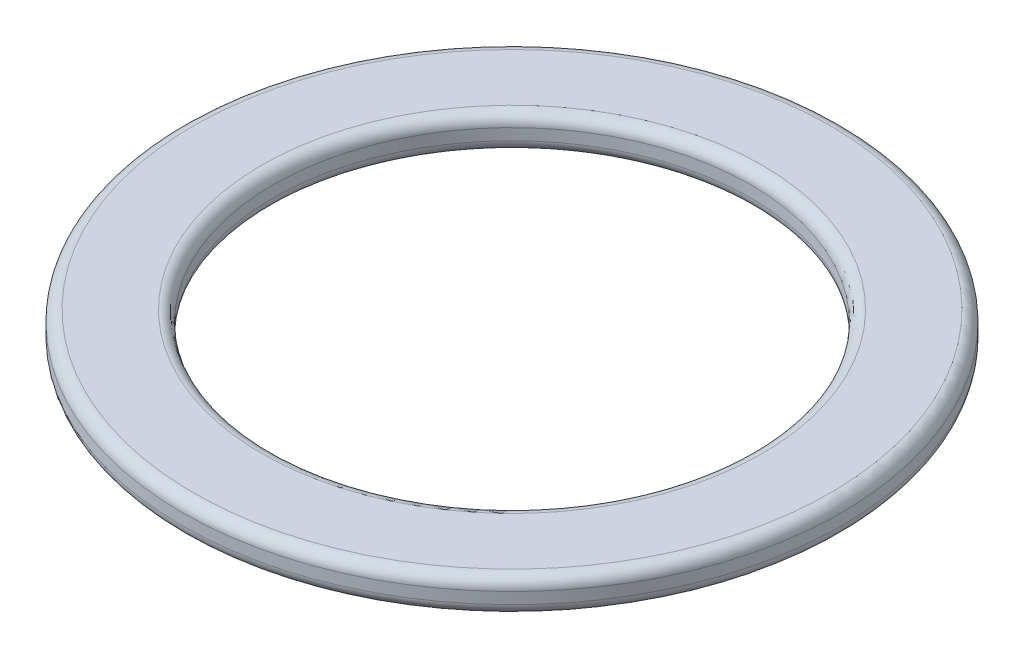
ISO-10303-21;
HEADER;
FILE_DESCRIPTION(('STEP AP214'),'2;1');
FILE_NAME('part.step','',(''),(''),'','','');
FILE_SCHEMA(('AUTOMOTIVE_DESIGN { 1 0 10303 214 1 1 1 1 }'));
ENDSEC;
DATA;
#1=APPLICATION_CONTEXT('core data for automotive mechanical design processes');
#2=APPLICATION_PROTOCOL_DEFINITION('international standard','automotive_design',2000,#1);
#3=PRODUCT_CONTEXT('',#1,'mechanical');
#4=PRODUCT('Part','Part','',(#3));
#5=PRODUCT_RELATED_PRODUCT_CATEGORY('part','',(#4));
#6=PRODUCT_DEFINITION_FORMATION('','',#4);
#7=PRODUCT_DEFINITION_CONTEXT('part definition',#1,'design');
#8=PRODUCT_DEFINITION('design','',#6,#7);
#9=PRODUCT_DEFINITION_SHAPE('','',#8);
#10=(LENGTH_UNIT() NAMED_UNIT(*) SI_UNIT(.MILLI.,.METRE.));
#11=(NAMED_UNIT(*) PLANE_ANGLE_UNIT() SI_UNIT($,.RADIAN.));
#12=(NAMED_UNIT(*) SI_UNIT($,.STERADIAN.) SOLID_ANGLE_UNIT());
#13=UNCERTAINTY_MEASURE_WITH_UNIT(LENGTH_MEASURE(1.E-05),#10,'distance_accuracy_value','');
#14=(GEOMETRIC_REPRESENTATION_CONTEXT(3) GLOBAL_UNCERTAINTY_ASSIGNED_CONTEXT((#13)) GLOBAL_UNIT_ASSIGNED_CONTEXT((#10,
#11,#12)) REPRESENTATION_CONTEXT('',''));
#15=CARTESIAN_POINT('',(0.,0.,0.));
#16=DIRECTION('',(0.,0.,1.));
#17=DIRECTION('',(1.,0.,0.));
#18=AXIS2_PLACEMENT_3D('',#15,#16,#17);
#19=CARTESIAN_POINT('',(0.,0.,0.));
#20=DIRECTION('',(0.,-1.,0.));
#21=DIRECTION('',(0.,0.,-1.));
#22=AXIS2_PLACEMENT_3D('',#19,#20,#21);
#23=CYLINDRICAL_SURFACE('',#22,21.);
#24=CARTESIAN_POINT('',(0.,1.,0.));
#25=DIRECTION('',(0.,1.,0.));
#26=DIRECTION('',(0.,0.,1.));
#27=AXIS2_PLACEMENT_3D('',#24,#25,#26);
#28=CIRCLE('',#27,21.);
#29=CARTESIAN_POINT('',(0.,1.,21.));
#30=VERTEX_POINT('',#29);
#31=EDGE_CURVE('E55',#30,#30,#28,.F.);
#32=ORIENTED_EDGE('',*,*,#31,.T.);
#33=EDGE_LOOP('',(#32));
#34=FACE_BOUND('',#33,.T.);
#35=CARTESIAN_POINT('',(0.,2.,0.));
#36=DIRECTION('',(0.,-1.,0.));
#37=DIRECTION('',(0.,0.,-1.));
#38=AXIS2_PLACEMENT_3D('',#35,#36,#37);
#39=CIRCLE('',#38,21.);
#40=CARTESIAN_POINT('',(0.,2.,-21.));
#41=VERTEX_POINT('',#40);
#42=EDGE_CURVE('E58',#41,#41,#39,.F.);
#43=ORIENTED_EDGE('',*,*,#42,.T.);
#44=EDGE_LOOP('',(#43));
#45=FACE_BOUND('',#44,.T.);
#46=ADVANCED_FACE('F30',(#34,#45),#23,.F.);
#47=CARTESIAN_POINT('',(-21.,0.,0.));
#48=DIRECTION('',(0.,1.,0.));
#49=DIRECTION('',(0.,0.,1.));
#50=AXIS2_PLACEMENT_3D('',#47,#48,#49);
#51=PLANE('',#50);
#52=CARTESIAN_POINT('',(0.,0.,0.));
#53=DIRECTION('',(0.,1.,0.));
#54=DIRECTION('',(0.,0.,1.));
#55=AXIS2_PLACEMENT_3D('',#52,#53,#54);
#56=CIRCLE('',#55,22.);
#57=CARTESIAN_POINT('',(0.,0.,22.));
#58=VERTEX_POINT('',#57);
#59=EDGE_CURVE('E49',#58,#58,#56,.T.);
#60=ORIENTED_EDGE('',*,*,#59,.T.);
#61=EDGE_LOOP('',(#60));
#62=FACE_BOUND('',#61,.T.);
#63=CARTESIAN_POINT('',(0.,0.,0.));
#64=DIRECTION('',(0.,1.,0.));
#65=DIRECTION('',(0.,0.,1.));
#66=AXIS2_PLACEMENT_3D('',#63,#64,#65);
#67=CIRCLE('',#66,28.);
#68=CARTESIAN_POINT('',(0.,0.,28.));
#69=VERTEX_POINT('',#68);
#70=EDGE_CURVE('E52',#69,#69,#67,.F.);
#71=ORIENTED_EDGE('',*,*,#70,.T.);
#72=EDGE_LOOP('',(#71));
#73=FACE_BOUND('',#72,.T.);
#74=ADVANCED_FACE('F88',(#62,#73),#51,.F.);
#75=CARTESIAN_POINT('',(0.,0.,0.));
#76=DIRECTION('',(0.,-1.,0.));
#77=DIRECTION('',(0.,0.,-1.));
#78=AXIS2_PLACEMENT_3D('',#75,#76,#77);
#79=CYLINDRICAL_SURFACE('',#78,29.);
#80=CARTESIAN_POINT('',(0.,1.,0.));
#81=DIRECTION('',(0.,1.,0.));
#82=DIRECTION('',(0.,0.,1.));
#83=AXIS2_PLACEMENT_3D('',#80,#81,#82);
#84=CIRCLE('',#83,29.);
#85=CARTESIAN_POINT('',(0.,1.,29.));
#86=VERTEX_POINT('',#85);
#87=EDGE_CURVE('E10',#86,#86,#84,.T.);
#88=ORIENTED_EDGE('',*,*,#87,.T.);
#89=EDGE_LOOP('',(#88));
#90=FACE_BOUND('',#89,.T.);
#91=CARTESIAN_POINT('',(0.,2.,0.));
#92=DIRECTION('',(0.,-1.,0.));
#93=DIRECTION('',(0.,0.,-1.));
#94=AXIS2_PLACEMENT_3D('',#91,#92,#93);
#95=CIRCLE('',#94,29.);
#96=CARTESIAN_POINT('',(0.,2.,-29.));
#97=VERTEX_POINT('',#96);
#98=EDGE_CURVE('E36',#97,#97,#95,.T.);
#99=ORIENTED_EDGE('',*,*,#98,.T.);
#100=EDGE_LOOP('',(#99));
#101=FACE_BOUND('',#100,.T.);
#102=ADVANCED_FACE('F74',(#90,#101),#79,.T.);
#103=CARTESIAN_POINT('',(-21.,3.,0.));
#104=DIRECTION('',(0.,-1.,0.));
#105=DIRECTION('',(0.,0.,-1.));
#106=AXIS2_PLACEMENT_3D('',#103,#104,#105);
#107=PLANE('',#106);
#108=CARTESIAN_POINT('',(0.,3.,0.));
#109=DIRECTION('',(0.,-1.,0.));
#110=DIRECTION('',(0.,0.,-1.));
#111=AXIS2_PLACEMENT_3D('',#108,#109,#110);
#112=CIRCLE('',#111,22.);
#113=CARTESIAN_POINT('',(0.,3.,-22.));
#114=VERTEX_POINT('',#113);
#115=EDGE_CURVE('E40',#114,#114,#112,.T.);
#116=ORIENTED_EDGE('',*,*,#115,.T.);
#117=EDGE_LOOP('',(#116));
#118=FACE_BOUND('',#117,.T.);
#119=CARTESIAN_POINT('',(0.,3.,0.));
#120=DIRECTION('',(0.,-1.,0.));
#121=DIRECTION('',(0.,0.,-1.));
#122=AXIS2_PLACEMENT_3D('',#119,#120,#121);
#123=CIRCLE('',#122,28.);
#124=CARTESIAN_POINT('',(0.,3.,-28.));
#125=VERTEX_POINT('',#124);
#126=EDGE_CURVE('E44',#125,#125,#123,.F.);
#127=ORIENTED_EDGE('',*,*,#126,.T.);
#128=EDGE_LOOP('',(#127));
#129=FACE_BOUND('',#128,.T.);
#130=ADVANCED_FACE('F71',(#118,#129),#107,.F.);
#131=CARTESIAN_POINT('',(0.,1.,0.));
#132=DIRECTION('',(0.,1.,0.));
#133=DIRECTION('',(0.,0.,1.));
#134=AXIS2_PLACEMENT_3D('',#131,#132,#133);
#135=TOROIDAL_SURFACE('',#134,22.,1.);
#136=ORIENTED_EDGE('',*,*,#59,.F.);
#137=EDGE_LOOP('',(#136));
#138=FACE_BOUND('',#137,.T.);
#139=ORIENTED_EDGE('',*,*,#31,.F.);
#140=EDGE_LOOP('',(#139));
#141=FACE_BOUND('',#140,.T.);
#142=ADVANCED_FACE('F67',(#138,#141),#135,.T.);
#143=CARTESIAN_POINT('',(0.,2.,0.));
#144=DIRECTION('',(0.,-1.,0.));
#145=DIRECTION('',(0.,0.,-1.));
#146=AXIS2_PLACEMENT_3D('',#143,#144,#145);
#147=TOROIDAL_SURFACE('',#146,22.,1.);
#148=ORIENTED_EDGE('',*,*,#42,.F.);
#149=EDGE_LOOP('',(#148));
#150=FACE_BOUND('',#149,.T.);
#151=ORIENTED_EDGE('',*,*,#115,.F.);
#152=EDGE_LOOP('',(#151));
#153=FACE_BOUND('',#152,.T.);
#154=ADVANCED_FACE('F63',(#150,#153),#147,.T.);
#155=CARTESIAN_POINT('',(0.,1.,0.));
#156=DIRECTION('',(0.,1.,0.));
#157=DIRECTION('',(0.,0.,1.));
#158=AXIS2_PLACEMENT_3D('',#155,#156,#157);
#159=TOROIDAL_SURFACE('',#158,28.,1.);
#160=ORIENTED_EDGE('',*,*,#87,.F.);
#161=EDGE_LOOP('',(#160));
#162=FACE_BOUND('',#161,.T.);
#163=ORIENTED_EDGE('',*,*,#70,.F.);
#164=EDGE_LOOP('',(#163));
#165=FACE_BOUND('',#164,.T.);
#166=ADVANCED_FACE('F66',(#162,#165),#159,.T.);
#167=CARTESIAN_POINT('',(0.,2.,0.));
#168=DIRECTION('',(0.,-1.,0.));
#169=DIRECTION('',(0.,0.,-1.));
#170=AXIS2_PLACEMENT_3D('',#167,#168,#169);
#171=TOROIDAL_SURFACE('',#170,28.,1.);
#172=ORIENTED_EDGE('',*,*,#126,.F.);
#173=EDGE_LOOP('',(#172));
#174=FACE_BOUND('',#173,.T.);
#175=ORIENTED_EDGE('',*,*,#98,.F.);
#176=EDGE_LOOP('',(#175));
#177=FACE_BOUND('',#176,.T.);
#178=ADVANCED_FACE('F78',(#174,#177),#171,.T.);
#179=CLOSED_SHELL('',(#46,#74,#102,#130,#142,#154,#166,#178));
#180=MANIFOLD_SOLID_BREP('B2',#179);
#181=ADVANCED_BREP_SHAPE_REPRESENTATION('',(#18,#180),#14);
#182=SHAPE_DEFINITION_REPRESENTATION(#9,#181);
ENDSEC;
END-ISO-10303-21;
